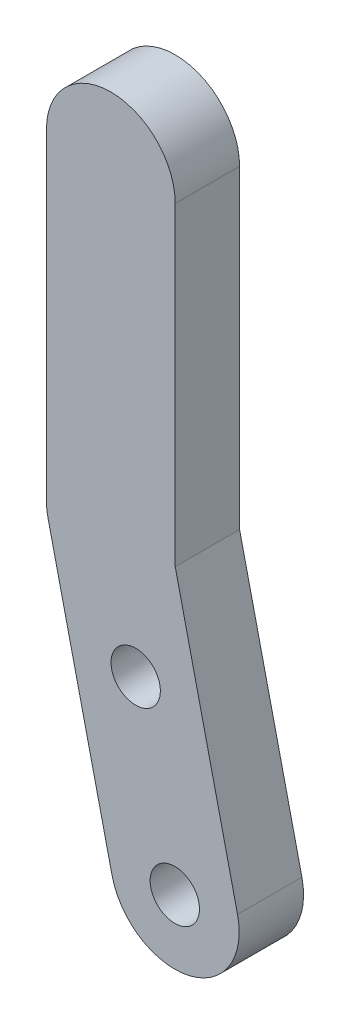
ISO-10303-21;
HEADER;
FILE_DESCRIPTION(('STEP AP214'),'2;1');
FILE_NAME('part.step','',(''),(''),'','','');
FILE_SCHEMA(('AUTOMOTIVE_DESIGN { 1 0 10303 214 1 1 1 1 }'));
ENDSEC;
DATA;
#1=APPLICATION_CONTEXT('core data for automotive mechanical design processes');
#2=APPLICATION_PROTOCOL_DEFINITION('international standard','automotive_design',2000,#1);
#3=PRODUCT_CONTEXT('',#1,'mechanical');
#4=PRODUCT('Part','Part','',(#3));
#5=PRODUCT_RELATED_PRODUCT_CATEGORY('part','',(#4));
#6=PRODUCT_DEFINITION_FORMATION('','',#4);
#7=PRODUCT_DEFINITION_CONTEXT('part definition',#1,'design');
#8=PRODUCT_DEFINITION('design','',#6,#7);
#9=PRODUCT_DEFINITION_SHAPE('','',#8);
#10=(LENGTH_UNIT() NAMED_UNIT(*) SI_UNIT(.MILLI.,.METRE.));
#11=(NAMED_UNIT(*) PLANE_ANGLE_UNIT() SI_UNIT($,.RADIAN.));
#12=(NAMED_UNIT(*) SI_UNIT($,.STERADIAN.) SOLID_ANGLE_UNIT());
#13=UNCERTAINTY_MEASURE_WITH_UNIT(LENGTH_MEASURE(1.E-05),#10,'distance_accuracy_value','');
#14=(GEOMETRIC_REPRESENTATION_CONTEXT(3) GLOBAL_UNCERTAINTY_ASSIGNED_CONTEXT((#13)) GLOBAL_UNIT_ASSIGNED_CONTEXT((#10,
#11,#12)) REPRESENTATION_CONTEXT('',''));
#15=CARTESIAN_POINT('',(0.,0.,0.));
#16=DIRECTION('',(0.,0.,1.));
#17=DIRECTION('',(1.,0.,0.));
#18=AXIS2_PLACEMENT_3D('',#15,#16,#17);
#19=CARTESIAN_POINT('',(0.,0.,3.));
#20=DIRECTION('',(0.,0.,1.));
#21=DIRECTION('',(1.,0.,0.));
#22=AXIS2_PLACEMENT_3D('',#19,#20,#21);
#23=PLANE('',#22);
#24=CARTESIAN_POINT('',(0.,0.,3.));
#25=DIRECTION('',(0.,0.,1.));
#26=DIRECTION('',(1.,0.,0.));
#27=AXIS2_PLACEMENT_3D('',#24,#25,#26);
#28=CIRCLE('',#27,1.15);
#29=CARTESIAN_POINT('',(1.15,0.,3.));
#30=VERTEX_POINT('',#29);
#31=EDGE_CURVE('E138',#30,#30,#28,.T.);
#32=ORIENTED_EDGE('',*,*,#31,.F.);
#33=EDGE_LOOP('',(#32));
#34=FACE_BOUND('',#33,.T.);
#35=CARTESIAN_POINT('',(0.,0.,3.));
#36=DIRECTION('',(0.,0.,1.));
#37=DIRECTION('',(1.,0.,0.));
#38=AXIS2_PLACEMENT_3D('',#35,#36,#37);
#39=CIRCLE('',#38,3.);
#40=CARTESIAN_POINT('',(-2.92311019435571,-0.674853163031596,3.));
#41=VERTEX_POINT('',#40);
#42=CARTESIAN_POINT('',(2.92311019435571,0.674853163031596,3.));
#43=VERTEX_POINT('',#42);
#44=EDGE_CURVE('E147',#41,#43,#39,.T.);
#45=ORIENTED_EDGE('',*,*,#44,.T.);
#46=DIRECTION('',(-0.224951054343865,0.974370064785235,0.));
#47=VECTOR('',#46,1.);
#48=CARTESIAN_POINT('',(2.92311019435571,0.674853163031596,3.));
#49=LINE('',#48,#47);
#50=CARTESIAN_POINT('',(0.0193985299437845,13.2522101833093,3.));
#51=VERTEX_POINT('',#50);
#52=EDGE_CURVE('E100',#43,#51,#49,.T.);
#53=ORIENTED_EDGE('',*,*,#52,.T.);
#54=DIRECTION('',(0.,1.,0.));
#55=VECTOR('',#54,1.);
#56=CARTESIAN_POINT('',(0.0193985299437845,13.2522101833093,3.));
#57=LINE('',#56,#55);
#58=CARTESIAN_POINT('',(0.0193985299437841,27.9104033584044,3.));
#59=VERTEX_POINT('',#58);
#60=EDGE_CURVE('E159',#51,#59,#57,.T.);
#61=ORIENTED_EDGE('',*,*,#60,.T.);
#62=CARTESIAN_POINT('',(-2.98060147005622,27.9104033584044,3.));
#63=DIRECTION('',(0.,0.,1.));
#64=DIRECTION('',(-1.,0.,0.));
#65=AXIS2_PLACEMENT_3D('',#62,#63,#64);
#66=CIRCLE('',#65,3.);
#67=CARTESIAN_POINT('',(-5.98060147005621,27.9104033584044,3.));
#68=VERTEX_POINT('',#67);
#69=EDGE_CURVE('E116',#59,#68,#66,.T.);
#70=ORIENTED_EDGE('',*,*,#69,.T.);
#71=DIRECTION('',(0.,-1.,0.));
#72=VECTOR('',#71,1.);
#73=CARTESIAN_POINT('',(-5.98060147005621,27.9104033584044,3.));
#74=LINE('',#73,#72);
#75=CARTESIAN_POINT('',(-5.98060147005621,12.9104033584043,3.));
#76=VERTEX_POINT('',#75);
#77=EDGE_CURVE('E110',#68,#76,#74,.T.);
#78=ORIENTED_EDGE('',*,*,#77,.T.);
#79=CARTESIAN_POINT('',(-2.98060147005629,12.9104033584043,3.));
#80=DIRECTION('',(0.,0.,1.));
#81=DIRECTION('',(1.,0.,0.));
#82=AXIS2_PLACEMENT_3D('',#79,#80,#81);
#83=CIRCLE('',#82,2.99999999999992);
#84=CARTESIAN_POINT('',(-5.90371166441192,12.2355501953728,3.));
#85=VERTEX_POINT('',#84);
#86=EDGE_CURVE('E114',#76,#85,#83,.T.);
#87=ORIENTED_EDGE('',*,*,#86,.T.);
#88=DIRECTION('',(0.224951054343865,-0.974370064785235,0.));
#89=VECTOR('',#88,1.);
#90=CARTESIAN_POINT('',(-2.92311019435571,-0.674853163031596,3.));
#91=LINE('',#90,#89);
#92=EDGE_CURVE('E60',#85,#41,#91,.T.);
#93=ORIENTED_EDGE('',*,*,#92,.T.);
#94=EDGE_LOOP('',(#45,#53,#61,#70,#78,#87,#93));
#95=FACE_BOUND('',#94,.T.);
#96=CARTESIAN_POINT('',(-1.82210354018531,7.8923975247604,3.));
#97=DIRECTION('',(0.,0.,1.));
#98=DIRECTION('',(1.,0.,0.));
#99=AXIS2_PLACEMENT_3D('',#96,#97,#98);
#100=CIRCLE('',#99,1.15);
#101=CARTESIAN_POINT('',(-0.672103540185308,7.8923975247604,3.));
#102=VERTEX_POINT('',#101);
#103=EDGE_CURVE('E174',#102,#102,#100,.T.);
#104=ORIENTED_EDGE('',*,*,#103,.F.);
#105=EDGE_LOOP('',(#104));
#106=FACE_BOUND('',#105,.T.);
#107=ADVANCED_FACE('F43',(#34,#95,#106),#23,.T.);
#108=CARTESIAN_POINT('',(0.,0.,0.));
#109=DIRECTION('',(0.,0.,1.));
#110=DIRECTION('',(1.,0.,0.));
#111=AXIS2_PLACEMENT_3D('',#108,#109,#110);
#112=PLANE('',#111);
#113=CARTESIAN_POINT('',(0.,0.,0.));
#114=DIRECTION('',(0.,0.,1.));
#115=DIRECTION('',(1.,0.,0.));
#116=AXIS2_PLACEMENT_3D('',#113,#114,#115);
#117=CIRCLE('',#116,3.);
#118=CARTESIAN_POINT('',(-2.92311019435571,-0.674853163031596,0.));
#119=VERTEX_POINT('',#118);
#120=CARTESIAN_POINT('',(2.92311019435571,0.674853163031596,0.));
#121=VERTEX_POINT('',#120);
#122=EDGE_CURVE('E134',#119,#121,#117,.T.);
#123=ORIENTED_EDGE('',*,*,#122,.F.);
#124=DIRECTION('',(0.224951054343865,-0.974370064785235,0.));
#125=VECTOR('',#124,1.);
#126=CARTESIAN_POINT('',(-2.92311019435571,-0.674853163031596,0.));
#127=LINE('',#126,#125);
#128=CARTESIAN_POINT('',(-5.90371166441192,12.2355501953728,0.));
#129=VERTEX_POINT('',#128);
#130=EDGE_CURVE('E92',#129,#119,#127,.T.);
#131=ORIENTED_EDGE('',*,*,#130,.F.);
#132=CARTESIAN_POINT('',(-2.98060147005629,12.9104033584043,0.));
#133=DIRECTION('',(0.,0.,1.));
#134=DIRECTION('',(1.,0.,0.));
#135=AXIS2_PLACEMENT_3D('',#132,#133,#134);
#136=CIRCLE('',#135,2.99999999999992);
#137=CARTESIAN_POINT('',(-5.98060147005621,12.9104033584043,0.));
#138=VERTEX_POINT('',#137);
#139=EDGE_CURVE('E86',#138,#129,#136,.T.);
#140=ORIENTED_EDGE('',*,*,#139,.F.);
#141=DIRECTION('',(0.,-1.,0.));
#142=VECTOR('',#141,1.);
#143=CARTESIAN_POINT('',(-5.98060147005621,27.9104033584044,0.));
#144=LINE('',#143,#142);
#145=CARTESIAN_POINT('',(-5.98060147005621,27.9104033584044,0.));
#146=VERTEX_POINT('',#145);
#147=EDGE_CURVE('E124',#146,#138,#144,.T.);
#148=ORIENTED_EDGE('',*,*,#147,.F.);
#149=CARTESIAN_POINT('',(-2.98060147005622,27.9104033584044,0.));
#150=DIRECTION('',(0.,0.,1.));
#151=DIRECTION('',(-1.,0.,0.));
#152=AXIS2_PLACEMENT_3D('',#149,#150,#151);
#153=CIRCLE('',#152,3.);
#154=CARTESIAN_POINT('',(0.0193985299437841,27.9104033584044,0.));
#155=VERTEX_POINT('',#154);
#156=EDGE_CURVE('E142',#155,#146,#153,.T.);
#157=ORIENTED_EDGE('',*,*,#156,.F.);
#158=DIRECTION('',(0.,1.,0.));
#159=VECTOR('',#158,1.);
#160=CARTESIAN_POINT('',(0.0193985299437845,13.2522101833093,0.));
#161=LINE('',#160,#159);
#162=CARTESIAN_POINT('',(0.0193985299437845,13.2522101833093,0.));
#163=VERTEX_POINT('',#162);
#164=EDGE_CURVE('E140',#163,#155,#161,.T.);
#165=ORIENTED_EDGE('',*,*,#164,.F.);
#166=DIRECTION('',(-0.224951054343865,0.974370064785235,0.));
#167=VECTOR('',#166,1.);
#168=CARTESIAN_POINT('',(2.92311019435571,0.674853163031596,0.));
#169=LINE('',#168,#167);
#170=EDGE_CURVE('E137',#121,#163,#169,.T.);
#171=ORIENTED_EDGE('',*,*,#170,.F.);
#172=EDGE_LOOP('',(#123,#131,#140,#148,#157,#165,#171));
#173=FACE_BOUND('',#172,.T.);
#174=CARTESIAN_POINT('',(0.,0.,0.));
#175=DIRECTION('',(0.,0.,1.));
#176=DIRECTION('',(1.,0.,0.));
#177=AXIS2_PLACEMENT_3D('',#174,#175,#176);
#178=CIRCLE('',#177,1.15);
#179=CARTESIAN_POINT('',(1.15,0.,0.));
#180=VERTEX_POINT('',#179);
#181=EDGE_CURVE('E171',#180,#180,#178,.T.);
#182=ORIENTED_EDGE('',*,*,#181,.T.);
#183=EDGE_LOOP('',(#182));
#184=FACE_BOUND('',#183,.T.);
#185=CARTESIAN_POINT('',(-1.82210354018531,7.8923975247604,0.));
#186=DIRECTION('',(0.,0.,1.));
#187=DIRECTION('',(1.,0.,0.));
#188=AXIS2_PLACEMENT_3D('',#185,#186,#187);
#189=CIRCLE('',#188,1.15);
#190=CARTESIAN_POINT('',(-0.672103540185308,7.8923975247604,0.));
#191=VERTEX_POINT('',#190);
#192=EDGE_CURVE('E177',#191,#191,#189,.T.);
#193=ORIENTED_EDGE('',*,*,#192,.T.);
#194=EDGE_LOOP('',(#193));
#195=FACE_BOUND('',#194,.T.);
#196=ADVANCED_FACE('F163',(#173,#184,#195),#112,.F.);
#197=CARTESIAN_POINT('',(0.,0.,3.));
#198=DIRECTION('',(0.,0.,-1.));
#199=DIRECTION('',(-1.,0.,0.));
#200=AXIS2_PLACEMENT_3D('',#197,#198,#199);
#201=CYLINDRICAL_SURFACE('',#200,3.);
#202=ORIENTED_EDGE('',*,*,#122,.T.);
#203=DIRECTION('',(0.,0.,-1.));
#204=VECTOR('',#203,1.);
#205=CARTESIAN_POINT('',(2.92311019435571,0.674853163031596,3.));
#206=LINE('',#205,#204);
#207=EDGE_CURVE('E11',#43,#121,#206,.T.);
#208=ORIENTED_EDGE('',*,*,#207,.F.);
#209=ORIENTED_EDGE('',*,*,#44,.F.);
#210=DIRECTION('',(0.,0.,-1.));
#211=VECTOR('',#210,1.);
#212=CARTESIAN_POINT('',(-2.92311019435571,-0.674853163031596,3.));
#213=LINE('',#212,#211);
#214=EDGE_CURVE('E130',#41,#119,#213,.T.);
#215=ORIENTED_EDGE('',*,*,#214,.T.);
#216=EDGE_LOOP('',(#202,#208,#209,#215));
#217=FACE_BOUND('',#216,.T.);
#218=ADVANCED_FACE('F45',(#217),#201,.T.);
#219=CARTESIAN_POINT('',(2.92311019435571,0.674853163031596,3.));
#220=DIRECTION('',(-0.974370064785235,-0.224951054343865,0.));
#221=DIRECTION('',(0.224951054343865,-0.974370064785235,0.));
#222=AXIS2_PLACEMENT_3D('',#219,#220,#221);
#223=PLANE('',#222);
#224=ORIENTED_EDGE('',*,*,#170,.T.);
#225=DIRECTION('',(0.,0.,-1.));
#226=VECTOR('',#225,1.);
#227=CARTESIAN_POINT('',(0.0193985299437845,13.2522101833093,3.));
#228=LINE('',#227,#226);
#229=EDGE_CURVE('E52',#51,#163,#228,.T.);
#230=ORIENTED_EDGE('',*,*,#229,.F.);
#231=ORIENTED_EDGE('',*,*,#52,.F.);
#232=ORIENTED_EDGE('',*,*,#207,.T.);
#233=EDGE_LOOP('',(#224,#230,#231,#232));
#234=FACE_BOUND('',#233,.T.);
#235=ADVANCED_FACE('F207',(#234),#223,.F.);
#236=CARTESIAN_POINT('',(0.0193985299437845,13.2522101833093,3.));
#237=DIRECTION('',(-1.,0.,0.));
#238=DIRECTION('',(0.,0.,1.));
#239=AXIS2_PLACEMENT_3D('',#236,#237,#238);
#240=PLANE('',#239);
#241=ORIENTED_EDGE('',*,*,#164,.T.);
#242=DIRECTION('',(0.,0.,-1.));
#243=VECTOR('',#242,1.);
#244=CARTESIAN_POINT('',(0.0193985299437841,27.9104033584044,3.));
#245=LINE('',#244,#243);
#246=EDGE_CURVE('E151',#59,#155,#245,.T.);
#247=ORIENTED_EDGE('',*,*,#246,.F.);
#248=ORIENTED_EDGE('',*,*,#60,.F.);
#249=ORIENTED_EDGE('',*,*,#229,.T.);
#250=EDGE_LOOP('',(#241,#247,#248,#249));
#251=FACE_BOUND('',#250,.T.);
#252=ADVANCED_FACE('F157',(#251),#240,.F.);
#253=CARTESIAN_POINT('',(-2.98060147005622,27.9104033584044,3.));
#254=DIRECTION('',(0.,0.,-1.));
#255=DIRECTION('',(-1.,0.,0.));
#256=AXIS2_PLACEMENT_3D('',#253,#254,#255);
#257=CYLINDRICAL_SURFACE('',#256,3.);
#258=ORIENTED_EDGE('',*,*,#156,.T.);
#259=DIRECTION('',(0.,0.,-1.));
#260=VECTOR('',#259,1.);
#261=CARTESIAN_POINT('',(-5.98060147005621,27.9104033584044,3.));
#262=LINE('',#261,#260);
#263=EDGE_CURVE('E125',#68,#146,#262,.T.);
#264=ORIENTED_EDGE('',*,*,#263,.F.);
#265=ORIENTED_EDGE('',*,*,#69,.F.);
#266=ORIENTED_EDGE('',*,*,#246,.T.);
#267=EDGE_LOOP('',(#258,#264,#265,#266));
#268=FACE_BOUND('',#267,.T.);
#269=ADVANCED_FACE('F166',(#268),#257,.T.);
#270=CARTESIAN_POINT('',(-5.98060147005621,27.9104033584044,3.));
#271=DIRECTION('',(1.,0.,0.));
#272=DIRECTION('',(0.,1.,0.));
#273=AXIS2_PLACEMENT_3D('',#270,#271,#272);
#274=PLANE('',#273);
#275=ORIENTED_EDGE('',*,*,#147,.T.);
#276=DIRECTION('',(0.,0.,-1.));
#277=VECTOR('',#276,1.);
#278=CARTESIAN_POINT('',(-5.98060147005621,12.9104033584043,3.));
#279=LINE('',#278,#277);
#280=EDGE_CURVE('E121',#76,#138,#279,.T.);
#281=ORIENTED_EDGE('',*,*,#280,.F.);
#282=ORIENTED_EDGE('',*,*,#77,.F.);
#283=ORIENTED_EDGE('',*,*,#263,.T.);
#284=EDGE_LOOP('',(#275,#281,#282,#283));
#285=FACE_BOUND('',#284,.T.);
#286=ADVANCED_FACE('F122',(#285),#274,.F.);
#287=CARTESIAN_POINT('',(-2.98060147005629,12.9104033584043,3.));
#288=DIRECTION('',(0.,0.,-1.));
#289=DIRECTION('',(-1.,0.,0.));
#290=AXIS2_PLACEMENT_3D('',#287,#288,#289);
#291=CYLINDRICAL_SURFACE('',#290,2.99999999999992);
#292=ORIENTED_EDGE('',*,*,#139,.T.);
#293=DIRECTION('',(0.,0.,-1.));
#294=VECTOR('',#293,1.);
#295=CARTESIAN_POINT('',(-5.90371166441192,12.2355501953728,3.));
#296=LINE('',#295,#294);
#297=EDGE_CURVE('E126',#85,#129,#296,.T.);
#298=ORIENTED_EDGE('',*,*,#297,.F.);
#299=ORIENTED_EDGE('',*,*,#86,.F.);
#300=ORIENTED_EDGE('',*,*,#280,.T.);
#301=EDGE_LOOP('',(#292,#298,#299,#300));
#302=FACE_BOUND('',#301,.T.);
#303=ADVANCED_FACE('F128',(#302),#291,.T.);
#304=CARTESIAN_POINT('',(-2.92311019435571,-0.674853163031596,3.));
#305=DIRECTION('',(0.974370064785235,0.224951054343865,0.));
#306=DIRECTION('',(-0.224951054343865,0.974370064785235,0.));
#307=AXIS2_PLACEMENT_3D('',#304,#305,#306);
#308=PLANE('',#307);
#309=ORIENTED_EDGE('',*,*,#130,.T.);
#310=ORIENTED_EDGE('',*,*,#214,.F.);
#311=ORIENTED_EDGE('',*,*,#92,.F.);
#312=ORIENTED_EDGE('',*,*,#297,.T.);
#313=EDGE_LOOP('',(#309,#310,#311,#312));
#314=FACE_BOUND('',#313,.T.);
#315=ADVANCED_FACE('F197',(#314),#308,.F.);
#316=CARTESIAN_POINT('',(0.,0.,3.));
#317=DIRECTION('',(0.,0.,-1.));
#318=DIRECTION('',(-1.,0.,0.));
#319=AXIS2_PLACEMENT_3D('',#316,#317,#318);
#320=CYLINDRICAL_SURFACE('',#319,1.15);
#321=ORIENTED_EDGE('',*,*,#31,.T.);
#322=EDGE_LOOP('',(#321));
#323=FACE_BOUND('',#322,.T.);
#324=ORIENTED_EDGE('',*,*,#181,.F.);
#325=EDGE_LOOP('',(#324));
#326=FACE_BOUND('',#325,.T.);
#327=ADVANCED_FACE('F194',(#323,#326),#320,.F.);
#328=CARTESIAN_POINT('',(-1.82210354018531,7.8923975247604,3.));
#329=DIRECTION('',(0.,0.,-1.));
#330=DIRECTION('',(-1.,0.,0.));
#331=AXIS2_PLACEMENT_3D('',#328,#329,#330);
#332=CYLINDRICAL_SURFACE('',#331,1.15);
#333=ORIENTED_EDGE('',*,*,#103,.T.);
#334=EDGE_LOOP('',(#333));
#335=FACE_BOUND('',#334,.T.);
#336=ORIENTED_EDGE('',*,*,#192,.F.);
#337=EDGE_LOOP('',(#336));
#338=FACE_BOUND('',#337,.T.);
#339=ADVANCED_FACE('F183',(#335,#338),#332,.F.);
#340=CLOSED_SHELL('',(#107,#196,#218,#235,#252,#269,#286,#303,#315,#327,#339));
#341=MANIFOLD_SOLID_BREP('B2',#340);
#342=ADVANCED_BREP_SHAPE_REPRESENTATION('',(#18,#341),#14);
#343=SHAPE_DEFINITION_REPRESENTATION(#9,#342);
ENDSEC;
END-ISO-10303-21;
